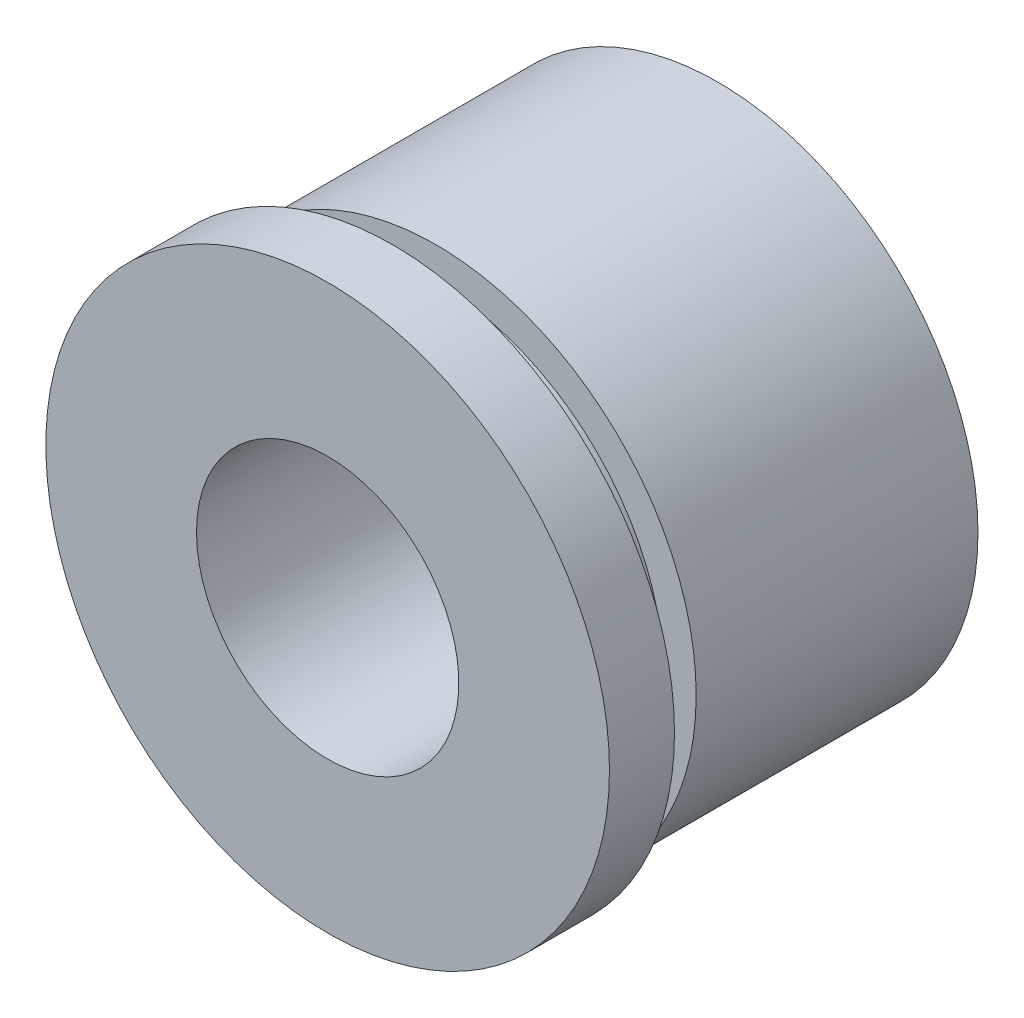
ISO-10303-21;
HEADER;
FILE_DESCRIPTION(('STEP AP214'),'2;1');
FILE_NAME('part.step','',(''),(''),'','','');
FILE_SCHEMA(('AUTOMOTIVE_DESIGN { 1 0 10303 214 1 1 1 1 }'));
ENDSEC;
DATA;
#1=APPLICATION_CONTEXT('core data for automotive mechanical design processes');
#2=APPLICATION_PROTOCOL_DEFINITION('international standard','automotive_design',2000,#1);
#3=PRODUCT_CONTEXT('',#1,'mechanical');
#4=PRODUCT('Part','Part','',(#3));
#5=PRODUCT_RELATED_PRODUCT_CATEGORY('part','',(#4));
#6=PRODUCT_DEFINITION_FORMATION('','',#4);
#7=PRODUCT_DEFINITION_CONTEXT('part definition',#1,'design');
#8=PRODUCT_DEFINITION('design','',#6,#7);
#9=PRODUCT_DEFINITION_SHAPE('','',#8);
#10=(LENGTH_UNIT() NAMED_UNIT(*) SI_UNIT(.MILLI.,.METRE.));
#11=(NAMED_UNIT(*) PLANE_ANGLE_UNIT() SI_UNIT($,.RADIAN.));
#12=(NAMED_UNIT(*) SI_UNIT($,.STERADIAN.) SOLID_ANGLE_UNIT());
#13=UNCERTAINTY_MEASURE_WITH_UNIT(LENGTH_MEASURE(1.E-05),#10,'distance_accuracy_value','');
#14=(GEOMETRIC_REPRESENTATION_CONTEXT(3) GLOBAL_UNCERTAINTY_ASSIGNED_CONTEXT((#13)) GLOBAL_UNIT_ASSIGNED_CONTEXT((#10,
#11,#12)) REPRESENTATION_CONTEXT('',''));
#15=CARTESIAN_POINT('',(0.,0.,0.));
#16=DIRECTION('',(0.,0.,1.));
#17=DIRECTION('',(1.,0.,0.));
#18=AXIS2_PLACEMENT_3D('',#15,#16,#17);
#19=CARTESIAN_POINT('',(0.,0.,7.5));
#20=DIRECTION('',(0.,0.,1.));
#21=DIRECTION('',(1.,0.,0.));
#22=AXIS2_PLACEMENT_3D('',#19,#20,#21);
#23=CYLINDRICAL_SURFACE('',#22,6.5);
#24=CARTESIAN_POINT('',(0.,0.,7.5));
#25=DIRECTION('',(0.,0.,1.));
#26=DIRECTION('',(1.,0.,0.));
#27=AXIS2_PLACEMENT_3D('',#24,#25,#26);
#28=CIRCLE('',#27,6.5);
#29=CARTESIAN_POINT('',(6.5,0.,7.5));
#30=VERTEX_POINT('',#29);
#31=EDGE_CURVE('E17',#30,#30,#28,.T.);
#32=ORIENTED_EDGE('',*,*,#31,.T.);
#33=EDGE_LOOP('',(#32));
#34=FACE_BOUND('',#33,.T.);
#35=CARTESIAN_POINT('',(0.,0.,9.));
#36=DIRECTION('',(0.,0.,1.));
#37=DIRECTION('',(1.,0.,0.));
#38=AXIS2_PLACEMENT_3D('',#35,#36,#37);
#39=CIRCLE('',#38,6.5);
#40=CARTESIAN_POINT('',(6.5,0.,9.));
#41=VERTEX_POINT('',#40);
#42=EDGE_CURVE('E39',#41,#41,#39,.T.);
#43=ORIENTED_EDGE('',*,*,#42,.F.);
#44=EDGE_LOOP('',(#43));
#45=FACE_BOUND('',#44,.T.);
#46=ADVANCED_FACE('F14',(#34,#45),#23,.T.);
#47=CARTESIAN_POINT('',(0.,0.,7.5));
#48=DIRECTION('',(0.,0.,1.));
#49=DIRECTION('',(1.,0.,0.));
#50=AXIS2_PLACEMENT_3D('',#47,#48,#49);
#51=PLANE('',#50);
#52=ORIENTED_EDGE('',*,*,#31,.F.);
#53=EDGE_LOOP('',(#52));
#54=FACE_BOUND('',#53,.T.);
#55=CARTESIAN_POINT('',(0.,0.,7.5));
#56=DIRECTION('',(0.,0.,-1.));
#57=DIRECTION('',(-1.,0.,0.));
#58=AXIS2_PLACEMENT_3D('',#55,#56,#57);
#59=CIRCLE('',#58,5.25);
#60=CARTESIAN_POINT('',(-5.25,0.,7.5));
#61=VERTEX_POINT('',#60);
#62=EDGE_CURVE('E37',#61,#61,#59,.T.);
#63=ORIENTED_EDGE('',*,*,#62,.F.);
#64=EDGE_LOOP('',(#63));
#65=FACE_BOUND('',#64,.T.);
#66=ADVANCED_FACE('F48',(#54,#65),#51,.F.);
#67=CARTESIAN_POINT('',(0.,0.,9.));
#68=DIRECTION('',(0.,0.,1.));
#69=DIRECTION('',(1.,0.,0.));
#70=AXIS2_PLACEMENT_3D('',#67,#68,#69);
#71=PLANE('',#70);
#72=ORIENTED_EDGE('',*,*,#42,.T.);
#73=EDGE_LOOP('',(#72));
#74=FACE_BOUND('',#73,.T.);
#75=CARTESIAN_POINT('',(0.,0.,9.));
#76=DIRECTION('',(0.,0.,-1.));
#77=DIRECTION('',(-1.,0.,0.));
#78=AXIS2_PLACEMENT_3D('',#75,#76,#77);
#79=CIRCLE('',#78,3.025);
#80=CARTESIAN_POINT('',(-3.025,0.,9.));
#81=VERTEX_POINT('',#80);
#82=EDGE_CURVE('E34',#81,#81,#79,.T.);
#83=ORIENTED_EDGE('',*,*,#82,.T.);
#84=EDGE_LOOP('',(#83));
#85=FACE_BOUND('',#84,.T.);
#86=ADVANCED_FACE('F51',(#74,#85),#71,.T.);
#87=CARTESIAN_POINT('',(0.,0.,9.));
#88=DIRECTION('',(0.,0.,-1.));
#89=DIRECTION('',(-1.,0.,0.));
#90=AXIS2_PLACEMENT_3D('',#87,#88,#89);
#91=CYLINDRICAL_SURFACE('',#90,5.25);
#92=CARTESIAN_POINT('',(0.,0.,6.5));
#93=DIRECTION('',(0.,0.,-1.));
#94=DIRECTION('',(-1.,0.,0.));
#95=AXIS2_PLACEMENT_3D('',#92,#93,#94);
#96=CIRCLE('',#95,5.25);
#97=CARTESIAN_POINT('',(-5.25,0.,6.5));
#98=VERTEX_POINT('',#97);
#99=EDGE_CURVE('E31',#98,#98,#96,.T.);
#100=ORIENTED_EDGE('',*,*,#99,.F.);
#101=EDGE_LOOP('',(#100));
#102=FACE_BOUND('',#101,.T.);
#103=ORIENTED_EDGE('',*,*,#62,.T.);
#104=EDGE_LOOP('',(#103));
#105=FACE_BOUND('',#104,.T.);
#106=ADVANCED_FACE('F54',(#102,#105),#91,.T.);
#107=CARTESIAN_POINT('',(0.,0.,6.5));
#108=DIRECTION('',(0.,0.,-1.));
#109=DIRECTION('',(-1.,0.,0.));
#110=AXIS2_PLACEMENT_3D('',#107,#108,#109);
#111=CYLINDRICAL_SURFACE('',#110,3.025);
#112=CARTESIAN_POINT('',(0.,0.,0.));
#113=DIRECTION('',(0.,0.,-1.));
#114=DIRECTION('',(-1.,0.,0.));
#115=AXIS2_PLACEMENT_3D('',#112,#113,#114);
#116=CIRCLE('',#115,3.025);
#117=CARTESIAN_POINT('',(-3.025,0.,0.));
#118=VERTEX_POINT('',#117);
#119=EDGE_CURVE('E26',#118,#118,#116,.T.);
#120=ORIENTED_EDGE('',*,*,#119,.T.);
#121=EDGE_LOOP('',(#120));
#122=FACE_BOUND('',#121,.T.);
#123=ORIENTED_EDGE('',*,*,#82,.F.);
#124=EDGE_LOOP('',(#123));
#125=FACE_BOUND('',#124,.T.);
#126=ADVANCED_FACE('F56',(#122,#125),#111,.F.);
#127=CARTESIAN_POINT('',(0.,0.,6.5));
#128=DIRECTION('',(0.,0.,1.));
#129=DIRECTION('',(1.,0.,0.));
#130=AXIS2_PLACEMENT_3D('',#127,#128,#129);
#131=PLANE('',#130);
#132=CARTESIAN_POINT('',(0.,0.,6.5));
#133=DIRECTION('',(0.,0.,-1.));
#134=DIRECTION('',(-1.,0.,0.));
#135=AXIS2_PLACEMENT_3D('',#132,#133,#134);
#136=CIRCLE('',#135,6.);
#137=CARTESIAN_POINT('',(-6.,0.,6.5));
#138=VERTEX_POINT('',#137);
#139=EDGE_CURVE('E21',#138,#138,#136,.T.);
#140=ORIENTED_EDGE('',*,*,#139,.F.);
#141=EDGE_LOOP('',(#140));
#142=FACE_BOUND('',#141,.T.);
#143=ORIENTED_EDGE('',*,*,#99,.T.);
#144=EDGE_LOOP('',(#143));
#145=FACE_BOUND('',#144,.T.);
#146=ADVANCED_FACE('F64',(#142,#145),#131,.T.);
#147=CARTESIAN_POINT('',(0.,0.,0.));
#148=DIRECTION('',(0.,0.,1.));
#149=DIRECTION('',(1.,0.,0.));
#150=AXIS2_PLACEMENT_3D('',#147,#148,#149);
#151=PLANE('',#150);
#152=ORIENTED_EDGE('',*,*,#119,.F.);
#153=EDGE_LOOP('',(#152));
#154=FACE_BOUND('',#153,.T.);
#155=CARTESIAN_POINT('',(0.,0.,0.));
#156=DIRECTION('',(0.,0.,-1.));
#157=DIRECTION('',(-1.,0.,0.));
#158=AXIS2_PLACEMENT_3D('',#155,#156,#157);
#159=CIRCLE('',#158,6.);
#160=CARTESIAN_POINT('',(-6.,0.,0.));
#161=VERTEX_POINT('',#160);
#162=EDGE_CURVE('E10',#161,#161,#159,.F.);
#163=ORIENTED_EDGE('',*,*,#162,.F.);
#164=EDGE_LOOP('',(#163));
#165=FACE_BOUND('',#164,.T.);
#166=ADVANCED_FACE('F71',(#154,#165),#151,.F.);
#167=CARTESIAN_POINT('',(0.,0.,6.5));
#168=DIRECTION('',(0.,0.,-1.));
#169=DIRECTION('',(-1.,0.,0.));
#170=AXIS2_PLACEMENT_3D('',#167,#168,#169);
#171=CYLINDRICAL_SURFACE('',#170,6.);
#172=ORIENTED_EDGE('',*,*,#162,.T.);
#173=EDGE_LOOP('',(#172));
#174=FACE_BOUND('',#173,.T.);
#175=ORIENTED_EDGE('',*,*,#139,.T.);
#176=EDGE_LOOP('',(#175));
#177=FACE_BOUND('',#176,.T.);
#178=ADVANCED_FACE('F69',(#174,#177),#171,.T.);
#179=CLOSED_SHELL('',(#46,#66,#86,#106,#126,#146,#166,#178));
#180=MANIFOLD_SOLID_BREP('B1',#179);
#181=ADVANCED_BREP_SHAPE_REPRESENTATION('',(#18,#180),#14);
#182=SHAPE_DEFINITION_REPRESENTATION(#9,#181);
ENDSEC;
END-ISO-10303-21;
